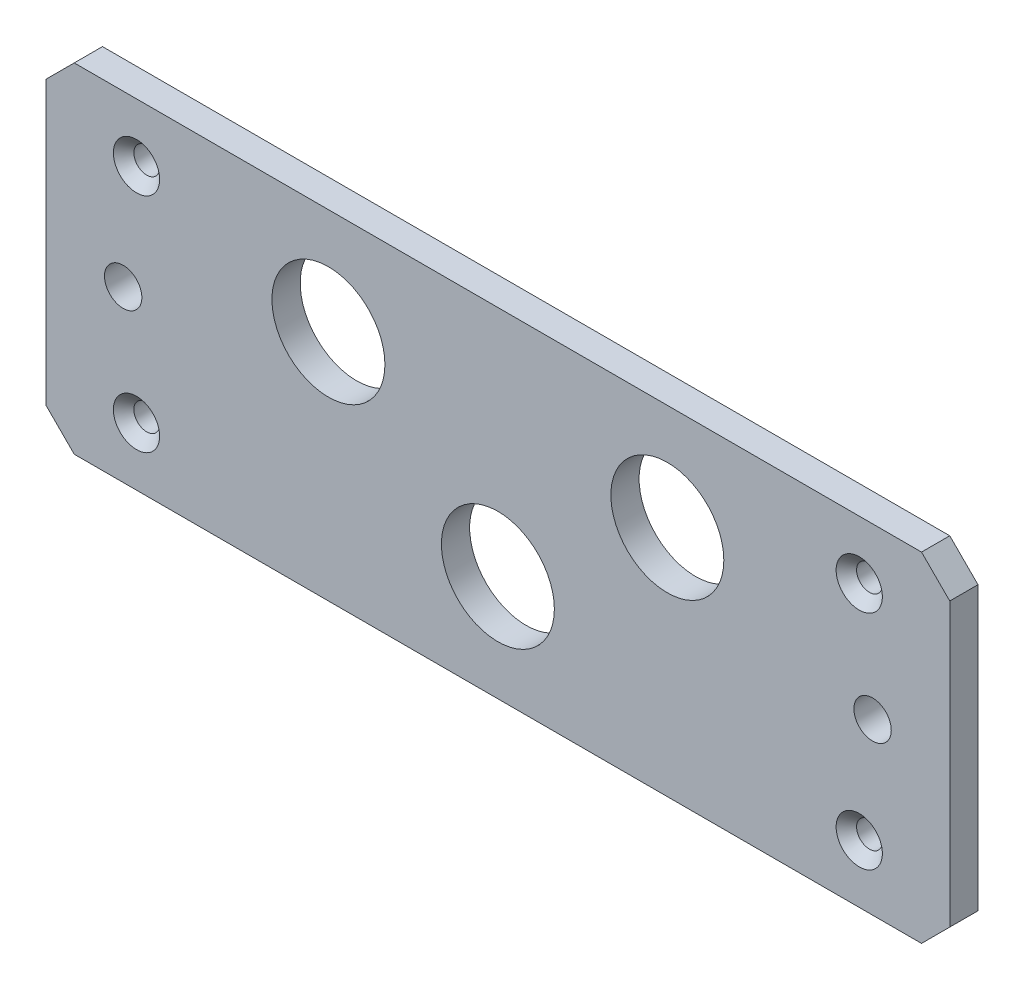
ISO-10303-21;
HEADER;
FILE_DESCRIPTION(('STEP AP214'),'2;1');
FILE_NAME('part.step','',(''),(''),'','','');
FILE_SCHEMA(('AUTOMOTIVE_DESIGN { 1 0 10303 214 1 1 1 1 }'));
ENDSEC;
DATA;
#1=APPLICATION_CONTEXT('core data for automotive mechanical design processes');
#2=APPLICATION_PROTOCOL_DEFINITION('international standard','automotive_design',2000,#1);
#3=PRODUCT_CONTEXT('',#1,'mechanical');
#4=PRODUCT('Part','Part','',(#3));
#5=PRODUCT_RELATED_PRODUCT_CATEGORY('part','',(#4));
#6=PRODUCT_DEFINITION_FORMATION('','',#4);
#7=PRODUCT_DEFINITION_CONTEXT('part definition',#1,'design');
#8=PRODUCT_DEFINITION('design','',#6,#7);
#9=PRODUCT_DEFINITION_SHAPE('','',#8);
#10=(LENGTH_UNIT() NAMED_UNIT(*) SI_UNIT(.MILLI.,.METRE.));
#11=(NAMED_UNIT(*) PLANE_ANGLE_UNIT() SI_UNIT($,.RADIAN.));
#12=(NAMED_UNIT(*) SI_UNIT($,.STERADIAN.) SOLID_ANGLE_UNIT());
#13=UNCERTAINTY_MEASURE_WITH_UNIT(LENGTH_MEASURE(1.E-05),#10,'distance_accuracy_value','');
#14=(GEOMETRIC_REPRESENTATION_CONTEXT(3) GLOBAL_UNCERTAINTY_ASSIGNED_CONTEXT((#13)) GLOBAL_UNIT_ASSIGNED_CONTEXT((#10,
#11,#12)) REPRESENTATION_CONTEXT('',''));
#15=CARTESIAN_POINT('',(0.,0.,0.));
#16=DIRECTION('',(0.,0.,1.));
#17=DIRECTION('',(1.,0.,0.));
#18=AXIS2_PLACEMENT_3D('',#15,#16,#17);
#19=CARTESIAN_POINT('',(-101.6,38.1,6.35));
#20=DIRECTION('',(1.,0.,0.));
#21=DIRECTION('',(0.,0.,-1.));
#22=AXIS2_PLACEMENT_3D('',#19,#20,#21);
#23=PLANE('',#22);
#24=DIRECTION('',(0.,-1.,0.));
#25=VECTOR('',#24,1.);
#26=CARTESIAN_POINT('',(-101.6,38.1,6.35));
#27=LINE('',#26,#25);
#28=CARTESIAN_POINT('',(-101.6,31.75,6.35));
#29=VERTEX_POINT('',#28);
#30=CARTESIAN_POINT('',(-101.6,-31.7499999999999,6.35));
#31=VERTEX_POINT('',#30);
#32=EDGE_CURVE('E132',#29,#31,#27,.T.);
#33=ORIENTED_EDGE('',*,*,#32,.F.);
#34=DIRECTION('',(0.,0.,-1.));
#35=VECTOR('',#34,1.);
#36=CARTESIAN_POINT('',(-101.6,31.75,6.35));
#37=LINE('',#36,#35);
#38=CARTESIAN_POINT('',(-101.6,31.75,0.));
#39=VERTEX_POINT('',#38);
#40=EDGE_CURVE('E11',#29,#39,#37,.T.);
#41=ORIENTED_EDGE('',*,*,#40,.T.);
#42=DIRECTION('',(0.,-1.,0.));
#43=VECTOR('',#42,1.);
#44=CARTESIAN_POINT('',(-101.6,38.1,0.));
#45=LINE('',#44,#43);
#46=CARTESIAN_POINT('',(-101.6,-31.7499999999999,0.));
#47=VERTEX_POINT('',#46);
#48=EDGE_CURVE('E168',#39,#47,#45,.T.);
#49=ORIENTED_EDGE('',*,*,#48,.T.);
#50=DIRECTION('',(0.,0.,1.));
#51=VECTOR('',#50,1.);
#52=CARTESIAN_POINT('',(-101.6,-31.75,6.35));
#53=LINE('',#52,#51);
#54=EDGE_CURVE('E46',#47,#31,#53,.T.);
#55=ORIENTED_EDGE('',*,*,#54,.T.);
#56=EDGE_LOOP('',(#33,#41,#49,#55));
#57=FACE_BOUND('',#56,.T.);
#58=ADVANCED_FACE('F37',(#57),#23,.F.);
#59=CARTESIAN_POINT('',(101.6,-38.1,6.35));
#60=DIRECTION('',(0.,1.,0.));
#61=DIRECTION('',(0.,0.,1.));
#62=AXIS2_PLACEMENT_3D('',#59,#60,#61);
#63=PLANE('',#62);
#64=DIRECTION('',(1.,0.,0.));
#65=VECTOR('',#64,1.);
#66=CARTESIAN_POINT('',(101.6,-38.1,0.));
#67=LINE('',#66,#65);
#68=CARTESIAN_POINT('',(-95.25,-38.1,0.));
#69=VERTEX_POINT('',#68);
#70=CARTESIAN_POINT('',(95.25,-38.1,0.));
#71=VERTEX_POINT('',#70);
#72=EDGE_CURVE('E137',#69,#71,#67,.T.);
#73=ORIENTED_EDGE('',*,*,#72,.T.);
#74=DIRECTION('',(0.,0.,1.));
#75=VECTOR('',#74,1.);
#76=CARTESIAN_POINT('',(95.25,-38.1,6.35));
#77=LINE('',#76,#75);
#78=CARTESIAN_POINT('',(95.25,-38.1,6.35));
#79=VERTEX_POINT('',#78);
#80=EDGE_CURVE('E53',#71,#79,#77,.T.);
#81=ORIENTED_EDGE('',*,*,#80,.T.);
#82=DIRECTION('',(1.,0.,0.));
#83=VECTOR('',#82,1.);
#84=CARTESIAN_POINT('',(101.6,-38.1,6.35));
#85=LINE('',#84,#83);
#86=CARTESIAN_POINT('',(-95.25,-38.1,6.35));
#87=VERTEX_POINT('',#86);
#88=EDGE_CURVE('E135',#87,#79,#85,.T.);
#89=ORIENTED_EDGE('',*,*,#88,.F.);
#90=DIRECTION('',(0.,0.,-1.));
#91=VECTOR('',#90,1.);
#92=CARTESIAN_POINT('',(-95.25,-38.1,6.35));
#93=LINE('',#92,#91);
#94=EDGE_CURVE('E160',#87,#69,#93,.T.);
#95=ORIENTED_EDGE('',*,*,#94,.T.);
#96=EDGE_LOOP('',(#73,#81,#89,#95));
#97=FACE_BOUND('',#96,.T.);
#98=ADVANCED_FACE('F175',(#97),#63,.F.);
#99=CARTESIAN_POINT('',(101.6,38.1,6.35));
#100=DIRECTION('',(-1.,0.,0.));
#101=DIRECTION('',(0.,0.,1.));
#102=AXIS2_PLACEMENT_3D('',#99,#100,#101);
#103=PLANE('',#102);
#104=DIRECTION('',(0.,1.,0.));
#105=VECTOR('',#104,1.);
#106=CARTESIAN_POINT('',(101.6,38.1,0.));
#107=LINE('',#106,#105);
#108=CARTESIAN_POINT('',(101.6,-31.75,0.));
#109=VERTEX_POINT('',#108);
#110=CARTESIAN_POINT('',(101.6,31.75,0.));
#111=VERTEX_POINT('',#110);
#112=EDGE_CURVE('E133',#109,#111,#107,.T.);
#113=ORIENTED_EDGE('',*,*,#112,.T.);
#114=DIRECTION('',(0.,0.,1.));
#115=VECTOR('',#114,1.);
#116=CARTESIAN_POINT('',(101.6,31.75,6.35));
#117=LINE('',#116,#115);
#118=CARTESIAN_POINT('',(101.6,31.75,6.35));
#119=VERTEX_POINT('',#118);
#120=EDGE_CURVE('E110',#111,#119,#117,.T.);
#121=ORIENTED_EDGE('',*,*,#120,.T.);
#122=DIRECTION('',(0.,1.,0.));
#123=VECTOR('',#122,1.);
#124=CARTESIAN_POINT('',(101.6,38.1,6.35));
#125=LINE('',#124,#123);
#126=CARTESIAN_POINT('',(101.6,-31.75,6.35));
#127=VERTEX_POINT('',#126);
#128=EDGE_CURVE('E180',#127,#119,#125,.T.);
#129=ORIENTED_EDGE('',*,*,#128,.F.);
#130=DIRECTION('',(0.,0.,-1.));
#131=VECTOR('',#130,1.);
#132=CARTESIAN_POINT('',(101.6,-31.75,6.35));
#133=LINE('',#132,#131);
#134=EDGE_CURVE('E115',#127,#109,#133,.T.);
#135=ORIENTED_EDGE('',*,*,#134,.T.);
#136=EDGE_LOOP('',(#113,#121,#129,#135));
#137=FACE_BOUND('',#136,.T.);
#138=ADVANCED_FACE('F283',(#137),#103,.F.);
#139=CARTESIAN_POINT('',(101.6,38.1,6.35));
#140=DIRECTION('',(0.,-1.,0.));
#141=DIRECTION('',(0.,0.,-1.));
#142=AXIS2_PLACEMENT_3D('',#139,#140,#141);
#143=PLANE('',#142);
#144=DIRECTION('',(-1.,0.,0.));
#145=VECTOR('',#144,1.);
#146=CARTESIAN_POINT('',(101.6,38.1,6.35));
#147=LINE('',#146,#145);
#148=CARTESIAN_POINT('',(95.25,38.1,6.35));
#149=VERTEX_POINT('',#148);
#150=CARTESIAN_POINT('',(-95.25,38.1,6.35));
#151=VERTEX_POINT('',#150);
#152=EDGE_CURVE('E125',#149,#151,#147,.T.);
#153=ORIENTED_EDGE('',*,*,#152,.F.);
#154=DIRECTION('',(0.,0.,-1.));
#155=VECTOR('',#154,1.);
#156=CARTESIAN_POINT('',(95.25,38.1,6.35));
#157=LINE('',#156,#155);
#158=CARTESIAN_POINT('',(95.25,38.1,0.));
#159=VERTEX_POINT('',#158);
#160=EDGE_CURVE('E109',#149,#159,#157,.T.);
#161=ORIENTED_EDGE('',*,*,#160,.T.);
#162=DIRECTION('',(-1.,0.,0.));
#163=VECTOR('',#162,1.);
#164=CARTESIAN_POINT('',(101.6,38.1,0.));
#165=LINE('',#164,#163);
#166=CARTESIAN_POINT('',(-95.25,38.1,0.));
#167=VERTEX_POINT('',#166);
#168=EDGE_CURVE('E122',#159,#167,#165,.T.);
#169=ORIENTED_EDGE('',*,*,#168,.T.);
#170=DIRECTION('',(0.,0.,1.));
#171=VECTOR('',#170,1.);
#172=CARTESIAN_POINT('',(-95.25,38.1,6.35));
#173=LINE('',#172,#171);
#174=EDGE_CURVE('E127',#167,#151,#173,.T.);
#175=ORIENTED_EDGE('',*,*,#174,.T.);
#176=EDGE_LOOP('',(#153,#161,#169,#175));
#177=FACE_BOUND('',#176,.T.);
#178=ADVANCED_FACE('F121',(#177),#143,.F.);
#179=CARTESIAN_POINT('',(0.,0.,6.35));
#180=DIRECTION('',(0.,0.,-1.));
#181=DIRECTION('',(-1.,0.,0.));
#182=AXIS2_PLACEMENT_3D('',#179,#180,#181);
#183=PLANE('',#182);
#184=CARTESIAN_POINT('',(0.,-14.2875,6.35));
#185=DIRECTION('',(0.,0.,1.));
#186=DIRECTION('',(1.,0.,0.));
#187=AXIS2_PLACEMENT_3D('',#184,#185,#186);
#188=CIRCLE('',#187,12.7);
#189=CARTESIAN_POINT('',(12.7,-14.2875,6.35));
#190=VERTEX_POINT('',#189);
#191=EDGE_CURVE('E240',#190,#190,#188,.T.);
#192=ORIENTED_EDGE('',*,*,#191,.F.);
#193=EDGE_LOOP('',(#192));
#194=FACE_BOUND('',#193,.T.);
#195=CARTESIAN_POINT('',(-38.1,14.2875,6.35));
#196=DIRECTION('',(0.,0.,1.));
#197=DIRECTION('',(1.,0.,0.));
#198=AXIS2_PLACEMENT_3D('',#195,#196,#197);
#199=CIRCLE('',#198,12.7);
#200=CARTESIAN_POINT('',(-25.4,14.2875,6.35));
#201=VERTEX_POINT('',#200);
#202=EDGE_CURVE('E234',#201,#201,#199,.T.);
#203=ORIENTED_EDGE('',*,*,#202,.F.);
#204=EDGE_LOOP('',(#203));
#205=FACE_BOUND('',#204,.T.);
#206=CARTESIAN_POINT('',(38.1,14.2875,6.35));
#207=DIRECTION('',(0.,0.,1.));
#208=DIRECTION('',(1.,0.,0.));
#209=AXIS2_PLACEMENT_3D('',#206,#207,#208);
#210=CIRCLE('',#209,12.7);
#211=CARTESIAN_POINT('',(50.8,14.2875,6.35));
#212=VERTEX_POINT('',#211);
#213=EDGE_CURVE('E228',#212,#212,#210,.T.);
#214=ORIENTED_EDGE('',*,*,#213,.F.);
#215=EDGE_LOOP('',(#214));
#216=FACE_BOUND('',#215,.T.);
#217=CARTESIAN_POINT('',(81.25,25.,6.35));
#218=DIRECTION('',(0.,0.,1.));
#219=DIRECTION('',(1.,0.,0.));
#220=AXIS2_PLACEMENT_3D('',#217,#218,#219);
#221=CIRCLE('',#220,5.2);
#222=CARTESIAN_POINT('',(86.45,25.,6.35));
#223=VERTEX_POINT('',#222);
#224=EDGE_CURVE('E222',#223,#223,#221,.T.);
#225=ORIENTED_EDGE('',*,*,#224,.F.);
#226=EDGE_LOOP('',(#225));
#227=FACE_BOUND('',#226,.T.);
#228=CARTESIAN_POINT('',(81.25,-25.,6.35));
#229=DIRECTION('',(0.,0.,1.));
#230=DIRECTION('',(1.,0.,0.));
#231=AXIS2_PLACEMENT_3D('',#228,#229,#230);
#232=CIRCLE('',#231,5.2);
#233=CARTESIAN_POINT('',(86.45,-25.,6.35));
#234=VERTEX_POINT('',#233);
#235=EDGE_CURVE('E213',#234,#234,#232,.T.);
#236=ORIENTED_EDGE('',*,*,#235,.F.);
#237=EDGE_LOOP('',(#236));
#238=FACE_BOUND('',#237,.T.);
#239=CARTESIAN_POINT('',(-81.25,-25.,6.35));
#240=DIRECTION('',(0.,0.,1.));
#241=DIRECTION('',(1.,0.,0.));
#242=AXIS2_PLACEMENT_3D('',#239,#240,#241);
#243=CIRCLE('',#242,5.2);
#244=CARTESIAN_POINT('',(-76.05,-25.,6.35));
#245=VERTEX_POINT('',#244);
#246=EDGE_CURVE('E204',#245,#245,#243,.T.);
#247=ORIENTED_EDGE('',*,*,#246,.F.);
#248=EDGE_LOOP('',(#247));
#249=FACE_BOUND('',#248,.T.);
#250=CARTESIAN_POINT('',(-81.25,25.,6.35));
#251=DIRECTION('',(0.,0.,1.));
#252=DIRECTION('',(1.,0.,0.));
#253=AXIS2_PLACEMENT_3D('',#250,#251,#252);
#254=CIRCLE('',#253,5.2);
#255=CARTESIAN_POINT('',(-76.05,25.,6.35));
#256=VERTEX_POINT('',#255);
#257=EDGE_CURVE('E195',#256,#256,#254,.T.);
#258=ORIENTED_EDGE('',*,*,#257,.F.);
#259=EDGE_LOOP('',(#258));
#260=FACE_BOUND('',#259,.T.);
#261=CARTESIAN_POINT('',(-84.25,0.,6.35));
#262=DIRECTION('',(0.,0.,1.));
#263=DIRECTION('',(1.,0.,0.));
#264=AXIS2_PLACEMENT_3D('',#261,#262,#263);
#265=CIRCLE('',#264,4.2);
#266=CARTESIAN_POINT('',(-80.05,0.,6.35));
#267=VERTEX_POINT('',#266);
#268=EDGE_CURVE('E145',#267,#267,#265,.T.);
#269=ORIENTED_EDGE('',*,*,#268,.F.);
#270=EDGE_LOOP('',(#269));
#271=FACE_BOUND('',#270,.T.);
#272=CARTESIAN_POINT('',(84.25,0.,6.35));
#273=DIRECTION('',(0.,0.,1.));
#274=DIRECTION('',(1.,0.,0.));
#275=AXIS2_PLACEMENT_3D('',#272,#273,#274);
#276=CIRCLE('',#275,4.2);
#277=CARTESIAN_POINT('',(88.45,0.,6.35));
#278=VERTEX_POINT('',#277);
#279=EDGE_CURVE('E144',#278,#278,#276,.T.);
#280=ORIENTED_EDGE('',*,*,#279,.F.);
#281=EDGE_LOOP('',(#280));
#282=FACE_BOUND('',#281,.T.);
#283=ORIENTED_EDGE('',*,*,#128,.T.);
#284=DIRECTION('',(0.707106781186544,-0.707106781186551,0.));
#285=VECTOR('',#284,1.);
#286=CARTESIAN_POINT('',(95.25,38.1,6.35));
#287=LINE('',#286,#285);
#288=EDGE_CURVE('E158',#119,#149,#287,.F.);
#289=ORIENTED_EDGE('',*,*,#288,.T.);
#290=ORIENTED_EDGE('',*,*,#152,.T.);
#291=DIRECTION('',(0.707106781186548,0.707106781186547,0.));
#292=VECTOR('',#291,1.);
#293=CARTESIAN_POINT('',(-101.6,31.75,6.35));
#294=LINE('',#293,#292);
#295=EDGE_CURVE('E154',#151,#29,#294,.F.);
#296=ORIENTED_EDGE('',*,*,#295,.T.);
#297=ORIENTED_EDGE('',*,*,#32,.T.);
#298=DIRECTION('',(-0.707106781186545,0.70710678118655,0.));
#299=VECTOR('',#298,1.);
#300=CARTESIAN_POINT('',(-95.25,-38.1,6.35));
#301=LINE('',#300,#299);
#302=EDGE_CURVE('E60',#31,#87,#301,.F.);
#303=ORIENTED_EDGE('',*,*,#302,.T.);
#304=ORIENTED_EDGE('',*,*,#88,.T.);
#305=DIRECTION('',(-0.707106781186549,-0.707106781186546,0.));
#306=VECTOR('',#305,1.);
#307=CARTESIAN_POINT('',(101.6,-31.75,6.35));
#308=LINE('',#307,#306);
#309=EDGE_CURVE('E156',#79,#127,#308,.F.);
#310=ORIENTED_EDGE('',*,*,#309,.T.);
#311=EDGE_LOOP('',(#283,#289,#290,#296,#297,#303,#304,#310));
#312=FACE_BOUND('',#311,.T.);
#313=ADVANCED_FACE('F171',(#194,#205,#216,#227,#238,#249,#260,#271,#282,#312),#183,.F.);
#314=CARTESIAN_POINT('',(0.,0.,0.));
#315=DIRECTION('',(0.,0.,-1.));
#316=DIRECTION('',(-1.,0.,0.));
#317=AXIS2_PLACEMENT_3D('',#314,#315,#316);
#318=PLANE('',#317);
#319=CARTESIAN_POINT('',(0.,-14.2875,0.));
#320=DIRECTION('',(0.,0.,1.));
#321=DIRECTION('',(1.,0.,0.));
#322=AXIS2_PLACEMENT_3D('',#319,#320,#321);
#323=CIRCLE('',#322,12.7);
#324=CARTESIAN_POINT('',(12.7,-14.2875,0.));
#325=VERTEX_POINT('',#324);
#326=EDGE_CURVE('E237',#325,#325,#323,.T.);
#327=ORIENTED_EDGE('',*,*,#326,.T.);
#328=EDGE_LOOP('',(#327));
#329=FACE_BOUND('',#328,.T.);
#330=CARTESIAN_POINT('',(-38.1,14.2875,0.));
#331=DIRECTION('',(0.,0.,1.));
#332=DIRECTION('',(1.,0.,0.));
#333=AXIS2_PLACEMENT_3D('',#330,#331,#332);
#334=CIRCLE('',#333,12.7);
#335=CARTESIAN_POINT('',(-25.4,14.2875,0.));
#336=VERTEX_POINT('',#335);
#337=EDGE_CURVE('E231',#336,#336,#334,.T.);
#338=ORIENTED_EDGE('',*,*,#337,.T.);
#339=EDGE_LOOP('',(#338));
#340=FACE_BOUND('',#339,.T.);
#341=CARTESIAN_POINT('',(38.1,14.2875,0.));
#342=DIRECTION('',(0.,0.,1.));
#343=DIRECTION('',(1.,0.,0.));
#344=AXIS2_PLACEMENT_3D('',#341,#342,#343);
#345=CIRCLE('',#344,12.7);
#346=CARTESIAN_POINT('',(50.8,14.2875,0.));
#347=VERTEX_POINT('',#346);
#348=EDGE_CURVE('E225',#347,#347,#345,.T.);
#349=ORIENTED_EDGE('',*,*,#348,.T.);
#350=EDGE_LOOP('',(#349));
#351=FACE_BOUND('',#350,.T.);
#352=CARTESIAN_POINT('',(81.25,25.,0.));
#353=DIRECTION('',(0.,0.,1.));
#354=DIRECTION('',(1.,0.,0.));
#355=AXIS2_PLACEMENT_3D('',#352,#353,#354);
#356=CIRCLE('',#355,2.89999999999999);
#357=CARTESIAN_POINT('',(84.15,25.,0.));
#358=VERTEX_POINT('',#357);
#359=EDGE_CURVE('E216',#358,#358,#356,.T.);
#360=ORIENTED_EDGE('',*,*,#359,.T.);
#361=EDGE_LOOP('',(#360));
#362=FACE_BOUND('',#361,.T.);
#363=CARTESIAN_POINT('',(81.25,-25.,0.));
#364=DIRECTION('',(0.,0.,1.));
#365=DIRECTION('',(1.,0.,0.));
#366=AXIS2_PLACEMENT_3D('',#363,#364,#365);
#367=CIRCLE('',#366,2.89999999999999);
#368=CARTESIAN_POINT('',(84.15,-25.,0.));
#369=VERTEX_POINT('',#368);
#370=EDGE_CURVE('E207',#369,#369,#367,.T.);
#371=ORIENTED_EDGE('',*,*,#370,.T.);
#372=EDGE_LOOP('',(#371));
#373=FACE_BOUND('',#372,.T.);
#374=CARTESIAN_POINT('',(-81.25,-25.,0.));
#375=DIRECTION('',(0.,0.,1.));
#376=DIRECTION('',(1.,0.,0.));
#377=AXIS2_PLACEMENT_3D('',#374,#375,#376);
#378=CIRCLE('',#377,2.89999999999999);
#379=CARTESIAN_POINT('',(-78.35,-25.,0.));
#380=VERTEX_POINT('',#379);
#381=EDGE_CURVE('E198',#380,#380,#378,.T.);
#382=ORIENTED_EDGE('',*,*,#381,.T.);
#383=EDGE_LOOP('',(#382));
#384=FACE_BOUND('',#383,.T.);
#385=CARTESIAN_POINT('',(-81.25,25.,0.));
#386=DIRECTION('',(0.,0.,1.));
#387=DIRECTION('',(1.,0.,0.));
#388=AXIS2_PLACEMENT_3D('',#385,#386,#387);
#389=CIRCLE('',#388,2.89999999999999);
#390=CARTESIAN_POINT('',(-78.35,25.,0.));
#391=VERTEX_POINT('',#390);
#392=EDGE_CURVE('E189',#391,#391,#389,.T.);
#393=ORIENTED_EDGE('',*,*,#392,.T.);
#394=EDGE_LOOP('',(#393));
#395=FACE_BOUND('',#394,.T.);
#396=CARTESIAN_POINT('',(-84.25,0.,0.));
#397=DIRECTION('',(0.,0.,-1.));
#398=DIRECTION('',(-1.,0.,0.));
#399=AXIS2_PLACEMENT_3D('',#396,#397,#398);
#400=CIRCLE('',#399,4.2);
#401=CARTESIAN_POINT('',(-88.45,0.,0.));
#402=VERTEX_POINT('',#401);
#403=EDGE_CURVE('E141',#402,#402,#400,.T.);
#404=ORIENTED_EDGE('',*,*,#403,.F.);
#405=EDGE_LOOP('',(#404));
#406=FACE_BOUND('',#405,.T.);
#407=CARTESIAN_POINT('',(84.25,0.,0.));
#408=DIRECTION('',(0.,0.,-1.));
#409=DIRECTION('',(-1.,0.,0.));
#410=AXIS2_PLACEMENT_3D('',#407,#408,#409);
#411=CIRCLE('',#410,4.2);
#412=CARTESIAN_POINT('',(80.05,0.,0.));
#413=VERTEX_POINT('',#412);
#414=EDGE_CURVE('E176',#413,#413,#411,.T.);
#415=ORIENTED_EDGE('',*,*,#414,.F.);
#416=EDGE_LOOP('',(#415));
#417=FACE_BOUND('',#416,.T.);
#418=ORIENTED_EDGE('',*,*,#168,.F.);
#419=DIRECTION('',(-0.707106781186544,0.707106781186551,0.));
#420=VECTOR('',#419,1.);
#421=CARTESIAN_POINT('',(66.6750000000005,66.6749999999999,0.));
#422=LINE('',#421,#420);
#423=EDGE_CURVE('E105',#159,#111,#422,.F.);
#424=ORIENTED_EDGE('',*,*,#423,.T.);
#425=ORIENTED_EDGE('',*,*,#112,.F.);
#426=DIRECTION('',(0.707106781186549,0.707106781186546,0.));
#427=VECTOR('',#426,1.);
#428=CARTESIAN_POINT('',(66.6749999999998,-66.6750000000001,0.));
#429=LINE('',#428,#427);
#430=EDGE_CURVE('E116',#109,#71,#429,.F.);
#431=ORIENTED_EDGE('',*,*,#430,.T.);
#432=ORIENTED_EDGE('',*,*,#72,.F.);
#433=DIRECTION('',(0.707106781186545,-0.70710678118655,0.));
#434=VECTOR('',#433,1.);
#435=CARTESIAN_POINT('',(-66.6750000000003,-66.6749999999999,0.));
#436=LINE('',#435,#434);
#437=EDGE_CURVE('E126',#69,#47,#436,.F.);
#438=ORIENTED_EDGE('',*,*,#437,.T.);
#439=ORIENTED_EDGE('',*,*,#48,.F.);
#440=DIRECTION('',(-0.707106781186548,-0.707106781186547,0.));
#441=VECTOR('',#440,1.);
#442=CARTESIAN_POINT('',(-66.6749999999999,66.675,0.));
#443=LINE('',#442,#441);
#444=EDGE_CURVE('E131',#39,#167,#443,.F.);
#445=ORIENTED_EDGE('',*,*,#444,.T.);
#446=EDGE_LOOP('',(#418,#424,#425,#431,#432,#438,#439,#445));
#447=FACE_BOUND('',#446,.T.);
#448=ADVANCED_FACE('F129',(#329,#340,#351,#362,#373,#384,#395,#406,#417,#447),#318,.T.);
#449=CARTESIAN_POINT('',(84.25,0.,6.35));
#450=DIRECTION('',(0.,0.,1.));
#451=DIRECTION('',(1.,0.,0.));
#452=AXIS2_PLACEMENT_3D('',#449,#450,#451);
#453=CYLINDRICAL_SURFACE('',#452,4.2);
#454=ORIENTED_EDGE('',*,*,#414,.T.);
#455=EDGE_LOOP('',(#454));
#456=FACE_BOUND('',#455,.T.);
#457=ORIENTED_EDGE('',*,*,#279,.T.);
#458=EDGE_LOOP('',(#457));
#459=FACE_BOUND('',#458,.T.);
#460=ADVANCED_FACE('F265',(#456,#459),#453,.F.);
#461=CARTESIAN_POINT('',(-84.25,0.,6.35));
#462=DIRECTION('',(0.,0.,1.));
#463=DIRECTION('',(1.,0.,0.));
#464=AXIS2_PLACEMENT_3D('',#461,#462,#463);
#465=CYLINDRICAL_SURFACE('',#464,4.2);
#466=ORIENTED_EDGE('',*,*,#403,.T.);
#467=EDGE_LOOP('',(#466));
#468=FACE_BOUND('',#467,.T.);
#469=ORIENTED_EDGE('',*,*,#268,.T.);
#470=EDGE_LOOP('',(#469));
#471=FACE_BOUND('',#470,.T.);
#472=ADVANCED_FACE('F267',(#468,#471),#465,.F.);
#473=CARTESIAN_POINT('',(95.25,38.1,6.35));
#474=DIRECTION('',(-0.707106781186551,-0.707106781186544,0.));
#475=DIRECTION('',(0.,0.,-1.));
#476=AXIS2_PLACEMENT_3D('',#473,#474,#475);
#477=PLANE('',#476);
#478=ORIENTED_EDGE('',*,*,#288,.F.);
#479=ORIENTED_EDGE('',*,*,#120,.F.);
#480=ORIENTED_EDGE('',*,*,#423,.F.);
#481=ORIENTED_EDGE('',*,*,#160,.F.);
#482=EDGE_LOOP('',(#478,#479,#480,#481));
#483=FACE_BOUND('',#482,.T.);
#484=ADVANCED_FACE('F108',(#483),#477,.F.);
#485=CARTESIAN_POINT('',(101.6,-31.75,6.35));
#486=DIRECTION('',(-0.707106781186546,0.707106781186549,0.));
#487=DIRECTION('',(0.,0.,-1.));
#488=AXIS2_PLACEMENT_3D('',#485,#486,#487);
#489=PLANE('',#488);
#490=ORIENTED_EDGE('',*,*,#309,.F.);
#491=ORIENTED_EDGE('',*,*,#80,.F.);
#492=ORIENTED_EDGE('',*,*,#430,.F.);
#493=ORIENTED_EDGE('',*,*,#134,.F.);
#494=EDGE_LOOP('',(#490,#491,#492,#493));
#495=FACE_BOUND('',#494,.T.);
#496=ADVANCED_FACE('F293',(#495),#489,.F.);
#497=CARTESIAN_POINT('',(-101.6,31.75,6.35));
#498=DIRECTION('',(0.707106781186547,-0.707106781186548,0.));
#499=DIRECTION('',(0.,0.,-1.));
#500=AXIS2_PLACEMENT_3D('',#497,#498,#499);
#501=PLANE('',#500);
#502=ORIENTED_EDGE('',*,*,#295,.F.);
#503=ORIENTED_EDGE('',*,*,#174,.F.);
#504=ORIENTED_EDGE('',*,*,#444,.F.);
#505=ORIENTED_EDGE('',*,*,#40,.F.);
#506=EDGE_LOOP('',(#502,#503,#504,#505));
#507=FACE_BOUND('',#506,.T.);
#508=ADVANCED_FACE('F298',(#507),#501,.F.);
#509=CARTESIAN_POINT('',(-95.25,-38.1,6.35));
#510=DIRECTION('',(0.70710678118655,0.707106781186545,0.));
#511=DIRECTION('',(0.,0.,-1.));
#512=AXIS2_PLACEMENT_3D('',#509,#510,#511);
#513=PLANE('',#512);
#514=ORIENTED_EDGE('',*,*,#302,.F.);
#515=ORIENTED_EDGE('',*,*,#54,.F.);
#516=ORIENTED_EDGE('',*,*,#437,.F.);
#517=ORIENTED_EDGE('',*,*,#94,.F.);
#518=EDGE_LOOP('',(#514,#515,#516,#517));
#519=FACE_BOUND('',#518,.T.);
#520=ADVANCED_FACE('F40',(#519),#513,.F.);
#521=CARTESIAN_POINT('',(-81.25,25.,6.35));
#522=DIRECTION('',(0.,0.,1.));
#523=DIRECTION('',(1.,0.,0.));
#524=AXIS2_PLACEMENT_3D('',#521,#522,#523);
#525=CYLINDRICAL_SURFACE('',#524,2.89999999999999);
#526=ORIENTED_EDGE('',*,*,#392,.F.);
#527=EDGE_LOOP('',(#526));
#528=FACE_BOUND('',#527,.T.);
#529=CARTESIAN_POINT('',(-81.25,25.,4.04999999999999));
#530=DIRECTION('',(0.,0.,1.));
#531=DIRECTION('',(1.,0.,0.));
#532=AXIS2_PLACEMENT_3D('',#529,#530,#531);
#533=CIRCLE('',#532,2.89999999999999);
#534=CARTESIAN_POINT('',(-78.35,25.,4.04999999999999));
#535=VERTEX_POINT('',#534);
#536=EDGE_CURVE('E192',#535,#535,#533,.T.);
#537=ORIENTED_EDGE('',*,*,#536,.T.);
#538=EDGE_LOOP('',(#537));
#539=FACE_BOUND('',#538,.T.);
#540=ADVANCED_FACE('F307',(#528,#539),#525,.F.);
#541=CARTESIAN_POINT('',(-81.25,25.,6.35));
#542=DIRECTION('',(0.,0.,1.));
#543=DIRECTION('',(1.,0.,0.));
#544=AXIS2_PLACEMENT_3D('',#541,#542,#543);
#545=CONICAL_SURFACE('',#544,5.2,0.785398163397448);
#546=ORIENTED_EDGE('',*,*,#536,.F.);
#547=EDGE_LOOP('',(#546));
#548=FACE_BOUND('',#547,.T.);
#549=ORIENTED_EDGE('',*,*,#257,.T.);
#550=EDGE_LOOP('',(#549));
#551=FACE_BOUND('',#550,.T.);
#552=ADVANCED_FACE('F389',(#548,#551),#545,.F.);
#553=CARTESIAN_POINT('',(-81.25,-25.,6.35));
#554=DIRECTION('',(0.,0.,1.));
#555=DIRECTION('',(1.,0.,0.));
#556=AXIS2_PLACEMENT_3D('',#553,#554,#555);
#557=CYLINDRICAL_SURFACE('',#556,2.89999999999999);
#558=ORIENTED_EDGE('',*,*,#381,.F.);
#559=EDGE_LOOP('',(#558));
#560=FACE_BOUND('',#559,.T.);
#561=CARTESIAN_POINT('',(-81.25,-25.,4.04999999999999));
#562=DIRECTION('',(0.,0.,1.));
#563=DIRECTION('',(1.,0.,0.));
#564=AXIS2_PLACEMENT_3D('',#561,#562,#563);
#565=CIRCLE('',#564,2.89999999999999);
#566=CARTESIAN_POINT('',(-78.35,-25.,4.04999999999999));
#567=VERTEX_POINT('',#566);
#568=EDGE_CURVE('E201',#567,#567,#565,.T.);
#569=ORIENTED_EDGE('',*,*,#568,.T.);
#570=EDGE_LOOP('',(#569));
#571=FACE_BOUND('',#570,.T.);
#572=ADVANCED_FACE('F385',(#560,#571),#557,.F.);
#573=CARTESIAN_POINT('',(-81.25,-25.,6.35));
#574=DIRECTION('',(0.,0.,1.));
#575=DIRECTION('',(1.,0.,0.));
#576=AXIS2_PLACEMENT_3D('',#573,#574,#575);
#577=CONICAL_SURFACE('',#576,5.2,0.785398163397448);
#578=ORIENTED_EDGE('',*,*,#568,.F.);
#579=EDGE_LOOP('',(#578));
#580=FACE_BOUND('',#579,.T.);
#581=ORIENTED_EDGE('',*,*,#246,.T.);
#582=EDGE_LOOP('',(#581));
#583=FACE_BOUND('',#582,.T.);
#584=ADVANCED_FACE('F381',(#580,#583),#577,.F.);
#585=CARTESIAN_POINT('',(81.25,-25.,6.35));
#586=DIRECTION('',(0.,0.,1.));
#587=DIRECTION('',(1.,0.,0.));
#588=AXIS2_PLACEMENT_3D('',#585,#586,#587);
#589=CYLINDRICAL_SURFACE('',#588,2.89999999999999);
#590=ORIENTED_EDGE('',*,*,#370,.F.);
#591=EDGE_LOOP('',(#590));
#592=FACE_BOUND('',#591,.T.);
#593=CARTESIAN_POINT('',(81.25,-25.,4.04999999999999));
#594=DIRECTION('',(0.,0.,1.));
#595=DIRECTION('',(1.,0.,0.));
#596=AXIS2_PLACEMENT_3D('',#593,#594,#595);
#597=CIRCLE('',#596,2.89999999999999);
#598=CARTESIAN_POINT('',(84.15,-25.,4.04999999999999));
#599=VERTEX_POINT('',#598);
#600=EDGE_CURVE('E210',#599,#599,#597,.T.);
#601=ORIENTED_EDGE('',*,*,#600,.T.);
#602=EDGE_LOOP('',(#601));
#603=FACE_BOUND('',#602,.T.);
#604=ADVANCED_FACE('F377',(#592,#603),#589,.F.);
#605=CARTESIAN_POINT('',(81.25,-25.,6.35));
#606=DIRECTION('',(0.,0.,1.));
#607=DIRECTION('',(1.,0.,0.));
#608=AXIS2_PLACEMENT_3D('',#605,#606,#607);
#609=CONICAL_SURFACE('',#608,5.2,0.785398163397448);
#610=ORIENTED_EDGE('',*,*,#600,.F.);
#611=EDGE_LOOP('',(#610));
#612=FACE_BOUND('',#611,.T.);
#613=ORIENTED_EDGE('',*,*,#235,.T.);
#614=EDGE_LOOP('',(#613));
#615=FACE_BOUND('',#614,.T.);
#616=ADVANCED_FACE('F373',(#612,#615),#609,.F.);
#617=CARTESIAN_POINT('',(81.25,25.,6.35));
#618=DIRECTION('',(0.,0.,1.));
#619=DIRECTION('',(1.,0.,0.));
#620=AXIS2_PLACEMENT_3D('',#617,#618,#619);
#621=CYLINDRICAL_SURFACE('',#620,2.89999999999999);
#622=ORIENTED_EDGE('',*,*,#359,.F.);
#623=EDGE_LOOP('',(#622));
#624=FACE_BOUND('',#623,.T.);
#625=CARTESIAN_POINT('',(81.25,25.,4.04999999999999));
#626=DIRECTION('',(0.,0.,1.));
#627=DIRECTION('',(1.,0.,0.));
#628=AXIS2_PLACEMENT_3D('',#625,#626,#627);
#629=CIRCLE('',#628,2.89999999999999);
#630=CARTESIAN_POINT('',(84.15,25.,4.04999999999999));
#631=VERTEX_POINT('',#630);
#632=EDGE_CURVE('E219',#631,#631,#629,.T.);
#633=ORIENTED_EDGE('',*,*,#632,.T.);
#634=EDGE_LOOP('',(#633));
#635=FACE_BOUND('',#634,.T.);
#636=ADVANCED_FACE('F369',(#624,#635),#621,.F.);
#637=CARTESIAN_POINT('',(81.25,25.,6.35));
#638=DIRECTION('',(0.,0.,1.));
#639=DIRECTION('',(1.,0.,0.));
#640=AXIS2_PLACEMENT_3D('',#637,#638,#639);
#641=CONICAL_SURFACE('',#640,5.2,0.785398163397448);
#642=ORIENTED_EDGE('',*,*,#632,.F.);
#643=EDGE_LOOP('',(#642));
#644=FACE_BOUND('',#643,.T.);
#645=ORIENTED_EDGE('',*,*,#224,.T.);
#646=EDGE_LOOP('',(#645));
#647=FACE_BOUND('',#646,.T.);
#648=ADVANCED_FACE('F341',(#644,#647),#641,.F.);
#649=CARTESIAN_POINT('',(38.1,14.2875,6.35));
#650=DIRECTION('',(0.,0.,1.));
#651=DIRECTION('',(1.,0.,0.));
#652=AXIS2_PLACEMENT_3D('',#649,#650,#651);
#653=CYLINDRICAL_SURFACE('',#652,12.7);
#654=ORIENTED_EDGE('',*,*,#348,.F.);
#655=EDGE_LOOP('',(#654));
#656=FACE_BOUND('',#655,.T.);
#657=ORIENTED_EDGE('',*,*,#213,.T.);
#658=EDGE_LOOP('',(#657));
#659=FACE_BOUND('',#658,.T.);
#660=ADVANCED_FACE('F335',(#656,#659),#653,.F.);
#661=CARTESIAN_POINT('',(-38.1,14.2875,6.35));
#662=DIRECTION('',(0.,0.,1.));
#663=DIRECTION('',(1.,0.,0.));
#664=AXIS2_PLACEMENT_3D('',#661,#662,#663);
#665=CYLINDRICAL_SURFACE('',#664,12.7);
#666=ORIENTED_EDGE('',*,*,#337,.F.);
#667=EDGE_LOOP('',(#666));
#668=FACE_BOUND('',#667,.T.);
#669=ORIENTED_EDGE('',*,*,#202,.T.);
#670=EDGE_LOOP('',(#669));
#671=FACE_BOUND('',#670,.T.);
#672=ADVANCED_FACE('F340',(#668,#671),#665,.F.);
#673=CARTESIAN_POINT('',(0.,-14.2875,6.35));
#674=DIRECTION('',(0.,0.,1.));
#675=DIRECTION('',(1.,0.,0.));
#676=AXIS2_PLACEMENT_3D('',#673,#674,#675);
#677=CYLINDRICAL_SURFACE('',#676,12.7);
#678=ORIENTED_EDGE('',*,*,#326,.F.);
#679=EDGE_LOOP('',(#678));
#680=FACE_BOUND('',#679,.T.);
#681=ORIENTED_EDGE('',*,*,#191,.T.);
#682=EDGE_LOOP('',(#681));
#683=FACE_BOUND('',#682,.T.);
#684=ADVANCED_FACE('F244',(#680,#683),#677,.F.);
#685=CLOSED_SHELL('',(#58,#98,#138,#178,#313,#448,#460,#472,#484,#496,#508,#520,#540,#552,#572,
#584,#604,#616,#636,#648,#660,#672,#684));
#686=MANIFOLD_SOLID_BREP('B2',#685);
#687=ADVANCED_BREP_SHAPE_REPRESENTATION('',(#18,#686),#14);
#688=SHAPE_DEFINITION_REPRESENTATION(#9,#687);
ENDSEC;
END-ISO-10303-21;
